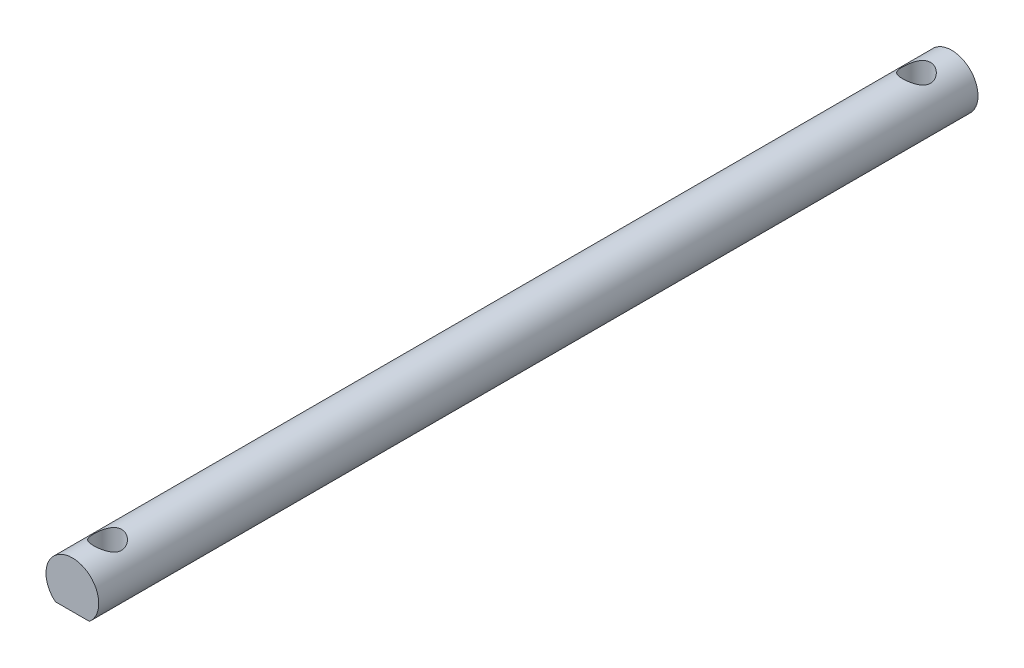
ISO-10303-21;
HEADER;
FILE_DESCRIPTION(('STEP AP214'),'2;1');
FILE_NAME('part.step','',(''),(''),'','','');
FILE_SCHEMA(('AUTOMOTIVE_DESIGN { 1 0 10303 214 1 1 1 1 }'));
ENDSEC;
DATA;
#1=APPLICATION_CONTEXT('core data for automotive mechanical design processes');
#2=APPLICATION_PROTOCOL_DEFINITION('international standard','automotive_design',2000,#1);
#3=PRODUCT_CONTEXT('',#1,'mechanical');
#4=PRODUCT('Part','Part','',(#3));
#5=PRODUCT_RELATED_PRODUCT_CATEGORY('part','',(#4));
#6=PRODUCT_DEFINITION_FORMATION('','',#4);
#7=PRODUCT_DEFINITION_CONTEXT('part definition',#1,'design');
#8=PRODUCT_DEFINITION('design','',#6,#7);
#9=PRODUCT_DEFINITION_SHAPE('','',#8);
#10=(LENGTH_UNIT() NAMED_UNIT(*) SI_UNIT(.MILLI.,.METRE.));
#11=(NAMED_UNIT(*) PLANE_ANGLE_UNIT() SI_UNIT($,.RADIAN.));
#12=(NAMED_UNIT(*) SI_UNIT($,.STERADIAN.) SOLID_ANGLE_UNIT());
#13=UNCERTAINTY_MEASURE_WITH_UNIT(LENGTH_MEASURE(1.E-05),#10,'distance_accuracy_value','');
#14=(GEOMETRIC_REPRESENTATION_CONTEXT(3) GLOBAL_UNCERTAINTY_ASSIGNED_CONTEXT((#13)) GLOBAL_UNIT_ASSIGNED_CONTEXT((#10,
#11,#12)) REPRESENTATION_CONTEXT('',''));
#15=CARTESIAN_POINT('',(0.,0.,0.));
#16=DIRECTION('',(0.,0.,1.));
#17=DIRECTION('',(1.,0.,0.));
#18=AXIS2_PLACEMENT_3D('',#15,#16,#17);
#19=CARTESIAN_POINT('',(0.,3.14727302685781,50.));
#20=DIRECTION('',(0.,0.,-1.));
#21=DIRECTION('',(-1.,0.,0.));
#22=AXIS2_PLACEMENT_3D('',#19,#20,#21);
#23=CYLINDRICAL_SURFACE('',#22,1.5);
#24=CARTESIAN_POINT('',(0.,3.14727302685781,50.));
#25=DIRECTION('',(0.,0.,1.));
#26=DIRECTION('',(1.,0.,0.));
#27=AXIS2_PLACEMENT_3D('',#24,#25,#26);
#28=CIRCLE('',#27,1.5);
#29=CARTESIAN_POINT('',(0.96631495996105,2.,50.));
#30=VERTEX_POINT('',#29);
#31=CARTESIAN_POINT('',(-0.96631495996105,2.,50.));
#32=VERTEX_POINT('',#31);
#33=EDGE_CURVE('E115',#30,#32,#28,.T.);
#34=ORIENTED_EDGE('',*,*,#33,.F.);
#35=DIRECTION('',(0.,0.,-1.));
#36=VECTOR('',#35,1.);
#37=CARTESIAN_POINT('',(0.96631495996105,2.,50.));
#38=LINE('',#37,#36);
#39=CARTESIAN_POINT('',(0.96631495996105,2.,46.5));
#40=VERTEX_POINT('',#39);
#41=EDGE_CURVE('E57',#30,#40,#38,.T.);
#42=ORIENTED_EDGE('',*,*,#41,.T.);
#43=CARTESIAN_POINT('',(0.,3.14727302685781,46.5));
#44=DIRECTION('',(0.,0.,1.));
#45=DIRECTION('',(1.,0.,0.));
#46=AXIS2_PLACEMENT_3D('',#43,#44,#45);
#47=CIRCLE('',#46,1.5);
#48=CARTESIAN_POINT('',(-0.96631495996105,2.,46.5));
#49=VERTEX_POINT('',#48);
#50=EDGE_CURVE('E11',#49,#40,#47,.T.);
#51=ORIENTED_EDGE('',*,*,#50,.F.);
#52=DIRECTION('',(0.,0.,-1.));
#53=VECTOR('',#52,1.);
#54=CARTESIAN_POINT('',(-0.96631495996105,2.,50.));
#55=LINE('',#54,#53);
#56=EDGE_CURVE('E105',#49,#32,#55,.F.);
#57=ORIENTED_EDGE('',*,*,#56,.T.);
#58=EDGE_LOOP('',(#34,#42,#51,#57));
#59=FACE_BOUND('',#58,.T.);
#60=CARTESIAN_POINT('',(0.,3.14727302685781,3.5));
#61=DIRECTION('',(0.,0.,-1.));
#62=DIRECTION('',(-1.,0.,0.));
#63=AXIS2_PLACEMENT_3D('',#60,#61,#62);
#64=CIRCLE('',#63,1.5);
#65=CARTESIAN_POINT('',(0.966314959961051,2.,3.5));
#66=VERTEX_POINT('',#65);
#67=CARTESIAN_POINT('',(-0.96631495996105,2.,3.5));
#68=VERTEX_POINT('',#67);
#69=EDGE_CURVE('E49',#66,#68,#64,.T.);
#70=ORIENTED_EDGE('',*,*,#69,.F.);
#71=DIRECTION('',(0.,0.,-1.));
#72=VECTOR('',#71,1.);
#73=CARTESIAN_POINT('',(0.96631495996105,2.,50.));
#74=LINE('',#73,#72);
#75=CARTESIAN_POINT('',(0.96631495996105,2.,0.));
#76=VERTEX_POINT('',#75);
#77=EDGE_CURVE('E92',#66,#76,#74,.T.);
#78=ORIENTED_EDGE('',*,*,#77,.T.);
#79=CARTESIAN_POINT('',(0.,3.14727302685781,0.));
#80=DIRECTION('',(0.,0.,1.));
#81=DIRECTION('',(1.,0.,0.));
#82=AXIS2_PLACEMENT_3D('',#79,#80,#81);
#83=CIRCLE('',#82,1.5);
#84=CARTESIAN_POINT('',(-0.96631495996105,2.,0.));
#85=VERTEX_POINT('',#84);
#86=EDGE_CURVE('E100',#76,#85,#83,.T.);
#87=ORIENTED_EDGE('',*,*,#86,.T.);
#88=DIRECTION('',(0.,0.,-1.));
#89=VECTOR('',#88,1.);
#90=CARTESIAN_POINT('',(-0.96631495996105,2.,50.));
#91=LINE('',#90,#89);
#92=EDGE_CURVE('E65',#85,#68,#91,.F.);
#93=ORIENTED_EDGE('',*,*,#92,.T.);
#94=EDGE_LOOP('',(#70,#78,#87,#93));
#95=FACE_BOUND('',#94,.T.);
#96=CARTESIAN_POINT('',(0.,4.64727302685781,1.2));
#97=CARTESIAN_POINT('',(-0.041714004293709,4.64727061100229,1.20000270828978));
#98=CARTESIAN_POINT('',(-0.0834672912539169,4.64551492046005,1.20328159641244));
#99=CARTESIAN_POINT('',(-0.165718197334509,4.63866432353752,1.21624170086605));
#100=CARTESIAN_POINT('',(-0.206213769841148,4.63356424555145,1.22593283300351));
#101=CARTESIAN_POINT('',(-0.284638594945811,4.62055339486435,1.25121983985831));
#102=CARTESIAN_POINT('',(-0.322577512237572,4.61265400677281,1.26679181418989));
#103=CARTESIAN_POINT('',(-0.395235474229212,4.59475052558151,1.30326255171199));
#104=CARTESIAN_POINT('',(-0.429954504316263,4.58474642293057,1.3241613390756));
#105=CARTESIAN_POINT('',(-0.497767319459639,4.56275203351812,1.37225156173175));
#106=CARTESIAN_POINT('',(-0.530602027463185,4.55067417496511,1.39976760351975));
#107=CARTESIAN_POINT('',(-0.591434030661653,4.52614344853048,1.45960314568675));
#108=CARTESIAN_POINT('',(-0.619427089896366,4.51369026334744,1.49192680673365));
#109=CARTESIAN_POINT('',(-0.672354419511099,4.48849443368043,1.56397805847776));
#110=CARTESIAN_POINT('',(-0.696776837026744,4.47582898387146,1.60411204866305));
#111=CARTESIAN_POINT('',(-0.738426416316995,4.45314141355328,1.68864568135116));
#112=CARTESIAN_POINT('',(-0.755659138193531,4.44311725264017,1.73304199480675));
#113=CARTESIAN_POINT('',(-0.781243551670882,4.42784697534304,1.82205426936129));
#114=CARTESIAN_POINT('',(-0.790083117424791,4.42234132251058,1.86648297209041));
#115=CARTESIAN_POINT('',(-0.800094972405448,4.41608633842723,1.95650387196576));
#116=CARTESIAN_POINT('',(-0.801276946959554,4.41533099901163,2.00209452613423));
#117=CARTESIAN_POINT('',(-0.796296021649253,4.41845951490916,2.08622186564664));
#118=CARTESIAN_POINT('',(-0.791143222976705,4.42170554042171,2.12484844662223));
#119=CARTESIAN_POINT('',(-0.775413455073683,4.43133619967712,2.20057462394201));
#120=CARTESIAN_POINT('',(-0.764834303757537,4.4377220960056,2.23767359950573));
#121=CARTESIAN_POINT('',(-0.738390252390663,4.4530358054286,2.31033802657356));
#122=CARTESIAN_POINT('',(-0.722411944930874,4.46201750086228,2.34585030308501));
#123=CARTESIAN_POINT('',(-0.685716522966988,4.4815234976867,2.4138695263574));
#124=CARTESIAN_POINT('',(-0.664997308543691,4.49204848191166,2.44637513236902));
#125=CARTESIAN_POINT('',(-0.615868522436844,4.51531827626026,2.51248586121327));
#126=CARTESIAN_POINT('',(-0.586776291159891,4.52816202179022,2.54555073524671));
#127=CARTESIAN_POINT('',(-0.523451373374352,4.55338861308904,2.60657535768995));
#128=CARTESIAN_POINT('',(-0.489215573049463,4.56577117396009,2.63453199079312));
#129=CARTESIAN_POINT('',(-0.414022077031181,4.58957313685314,2.68613771491421));
#130=CARTESIAN_POINT('',(-0.372785484410792,4.60089125773953,2.70943110819391));
#131=CARTESIAN_POINT('',(-0.286226859736145,4.62037697990036,2.7485478831769));
#132=CARTESIAN_POINT('',(-0.240908517249558,4.62854739187482,2.76437793200312));
#133=CARTESIAN_POINT('',(-0.151832213955905,4.64018298300011,2.78667761240728));
#134=CARTESIAN_POINT('',(-0.108300131382031,4.64400507678257,2.79386070130999));
#135=CARTESIAN_POINT('',(-0.0204895975412033,4.64777523712983,2.80094750320043));
#136=CARTESIAN_POINT('',(0.0237884072844007,4.64772554401872,2.80085542580229));
#137=CARTESIAN_POINT('',(0.107545959760608,4.64394684944613,2.79375007116933));
#138=CARTESIAN_POINT('',(0.147096449267732,4.64055199930067,2.78736535925174));
#139=CARTESIAN_POINT('',(0.224469554831582,4.63089491013627,2.76889255790208));
#140=CARTESIAN_POINT('',(0.262291990687247,4.62463237282267,2.7568038751433));
#141=CARTESIAN_POINT('',(0.336250167522202,4.6095987349747,2.72702505753177));
#142=CARTESIAN_POINT('',(0.372320333376869,4.60076897648171,2.70920276508172));
#143=CARTESIAN_POINT('',(0.441062157410962,4.58140740767542,2.6686248456984));
#144=CARTESIAN_POINT('',(0.473732482002725,4.57087493357745,2.6458672936231));
#145=CARTESIAN_POINT('',(0.538489644606411,4.54774948381134,2.59325519889227));
#146=CARTESIAN_POINT('',(0.570134865108252,4.5350567565271,2.56290033267114));
#147=CARTESIAN_POINT('',(0.628109862741503,4.50980011235093,2.49738716408484));
#148=CARTESIAN_POINT('',(0.654434715474712,4.49723632491743,2.46222446170796));
#149=CARTESIAN_POINT('',(0.70274076630891,4.47276817013746,2.38517351382497));
#150=CARTESIAN_POINT('',(0.724310244689175,4.46096513414908,2.34299186122059));
#151=CARTESIAN_POINT('',(0.759824848176573,4.44075237748749,2.25478990991383));
#152=CARTESIAN_POINT('',(0.773780830369481,4.43233782923438,2.20877518587825));
#153=CARTESIAN_POINT('',(0.792295451806952,4.42099816146799,2.11898615290246));
#154=CARTESIAN_POINT('',(0.797640611545244,4.41761611368446,2.07543381628454));
#155=CARTESIAN_POINT('',(0.801103834511684,4.41543662573423,1.98793968581964));
#156=CARTESIAN_POINT('',(0.799226824740039,4.41663606005343,1.94399817787743));
#157=CARTESIAN_POINT('',(0.789056350744178,4.42297550363614,1.86265364514195));
#158=CARTESIAN_POINT('',(0.781570591370404,4.42761878238289,1.82510510927249));
#159=CARTESIAN_POINT('',(0.761493436479322,4.43965994406853,1.75186604245893));
#160=CARTESIAN_POINT('',(0.748900147495982,4.44705884849119,1.71617620611579));
#161=CARTESIAN_POINT('',(0.718080352112418,4.4643496826021,1.64509522045344));
#162=CARTESIAN_POINT('',(0.699543207429632,4.4743715109762,1.60987143258423));
#163=CARTESIAN_POINT('',(0.657671226676286,4.49561263392224,1.54279806424025));
#164=CARTESIAN_POINT('',(0.634333807313365,4.50683257169302,1.51095031464064));
#165=CARTESIAN_POINT('',(0.579583602633468,4.53114572492608,1.44672690611971));
#166=CARTESIAN_POINT('',(0.547491018352179,4.54427514760882,1.41494125955117));
#167=CARTESIAN_POINT('',(0.47815016455982,4.56950132744853,1.35702772961191));
#168=CARTESIAN_POINT('',(0.440898582826824,4.581597413042,1.3309035088962));
#169=CARTESIAN_POINT('',(0.361022002622199,4.60378317795302,1.28456604006334));
#170=CARTESIAN_POINT('',(0.318288665753909,4.6138171327834,1.26451137357511));
#171=CARTESIAN_POINT('',(0.229399331630397,4.63031159256955,1.23214637726613));
#172=CARTESIAN_POINT('',(0.183252846928633,4.63678163400516,1.21981536787766));
#173=CARTESIAN_POINT('',(0.113807677907482,4.64312078794928,1.20780732872793));
#174=CARTESIAN_POINT('',(0.0911777471195388,4.64467247001677,1.20488511579837));
#175=CARTESIAN_POINT('',(0.0457024774465213,4.646749257487,1.20098069784147));
#176=CARTESIAN_POINT('',(0.0228571359907306,4.64727435062278,1.19999851599603));
#177=CARTESIAN_POINT('',(0.,4.64727302685781,1.2));
#178=B_SPLINE_CURVE_WITH_KNOTS('',3,(#96,#97,#98,#99,#100,#101,#102,#103,#104,#105,#106,#107,
#108,#109,#110,#111,#112,#113,#114,#115,#116,#117,#118,#119,#120,#121,#122,#123,#124,#125,#126,
#127,#128,#129,#130,#131,#132,#133,#134,#135,#136,#137,#138,#139,#140,#141,#142,#143,#144,#145,
#146,#147,#148,#149,#150,#151,#152,#153,#154,#155,#156,#157,#158,#159,#160,#161,#162,#163,#164,
#165,#166,#167,#168,#169,#170,#171,#172,#173,#174,#175,#176,#177),.UNSPECIFIED.,.T.,.F.,(4,2,2,
2,2,2,2,2,2,2,2,2,2,2,2,2,2,2,2,2,2,2,2,2,2,2,2,2,2,2,2,2,2,2,2,2,2,2,2,2,4),(0.,
0.125049785968992,0.250293400579707,0.375033395431379,0.49977395636337,0.632758937517726,
0.765859685119311,0.911100210896853,1.0562282067719,1.19228300426694,1.32816568589671,
1.44492819552126,1.5617376954166,1.68117137196064,1.80065805275817,1.93770170276478,
2.07482865313357,2.22012229846781,2.3652859036198,2.49740165319181,2.62944095746675,
2.74950324975936,2.86957803367867,2.99264692026345,3.11576390008819,3.2521377258514,
3.38863720347795,3.53432584534744,3.67980618389779,3.81103787448892,3.94218005404205,
4.05738088818269,4.17262446873054,4.29529226385602,4.41802624681407,4.55851375899382,
4.69909188991155,4.84307664846753,4.98667423094967,5.05519428454422,5.12371515689634),.UNSPECIFIED.);
#179=CARTESIAN_POINT('',(0.,4.64727302685781,1.2));
#180=VERTEX_POINT('',#179);
#181=EDGE_CURVE('E95',#180,#180,#178,.T.);
#182=ORIENTED_EDGE('',*,*,#181,.F.);
#183=EDGE_LOOP('',(#182));
#184=FACE_BOUND('',#183,.T.);
#185=CARTESIAN_POINT('',(0.,4.64727302685781,47.2));
#186=CARTESIAN_POINT('',(-0.0417140042937093,4.64727061100229,47.2000027082898));
#187=CARTESIAN_POINT('',(-0.0834672912539174,4.64551492046005,47.2032815964124));
#188=CARTESIAN_POINT('',(-0.16571819733451,4.63866432353752,47.216241700866));
#189=CARTESIAN_POINT('',(-0.206213769841149,4.63356424555145,47.2259328330035));
#190=CARTESIAN_POINT('',(-0.284638594945813,4.62055339486434,47.2512198398583));
#191=CARTESIAN_POINT('',(-0.322577512237574,4.61265400677281,47.2667918141899));
#192=CARTESIAN_POINT('',(-0.395235474229214,4.5947505255815,47.303262551712));
#193=CARTESIAN_POINT('',(-0.429954504316266,4.58474642293057,47.3241613390756));
#194=CARTESIAN_POINT('',(-0.497767319459641,4.56275203351812,47.3722515617318));
#195=CARTESIAN_POINT('',(-0.530602027463187,4.55067417496511,47.3997676035197));
#196=CARTESIAN_POINT('',(-0.591434030661654,4.52614344853048,47.4596031456867));
#197=CARTESIAN_POINT('',(-0.619427089896367,4.51369026334744,47.4919268067337));
#198=CARTESIAN_POINT('',(-0.672354419511101,4.48849443368043,47.5639780584778));
#199=CARTESIAN_POINT('',(-0.696776837026746,4.47582898387146,47.604112048663));
#200=CARTESIAN_POINT('',(-0.738426416316998,4.45314141355328,47.6886456813512));
#201=CARTESIAN_POINT('',(-0.755659138193533,4.44311725264017,47.7330419948067));
#202=CARTESIAN_POINT('',(-0.781243551670884,4.42784697534304,47.8220542693613));
#203=CARTESIAN_POINT('',(-0.790083117424793,4.42234132251058,47.8664829720904));
#204=CARTESIAN_POINT('',(-0.80009497240545,4.41608633842723,47.9565038719658));
#205=CARTESIAN_POINT('',(-0.801276946959556,4.41533099901163,48.0020945261342));
#206=CARTESIAN_POINT('',(-0.796296021649255,4.41845951490916,48.0862218656466));
#207=CARTESIAN_POINT('',(-0.791143222976708,4.42170554042171,48.1248484466222));
#208=CARTESIAN_POINT('',(-0.775413455073686,4.43133619967712,48.200574623942));
#209=CARTESIAN_POINT('',(-0.76483430375754,4.4377220960056,48.2376735995057));
#210=CARTESIAN_POINT('',(-0.738390252390665,4.45303580542859,48.3103380265736));
#211=CARTESIAN_POINT('',(-0.722411944930876,4.46201750086227,48.345850303085));
#212=CARTESIAN_POINT('',(-0.68571652296699,4.4815234976867,48.4138695263574));
#213=CARTESIAN_POINT('',(-0.664997308543694,4.49204848191166,48.446375132369));
#214=CARTESIAN_POINT('',(-0.615868522436846,4.51531827626026,48.5124858612133));
#215=CARTESIAN_POINT('',(-0.586776291159892,4.52816202179022,48.5455507352467));
#216=CARTESIAN_POINT('',(-0.523451373374352,4.55338861308904,48.60657535769));
#217=CARTESIAN_POINT('',(-0.489215573049463,4.56577117396009,48.6345319907931));
#218=CARTESIAN_POINT('',(-0.414022077031182,4.58957313685314,48.6861377149142));
#219=CARTESIAN_POINT('',(-0.372785484410792,4.60089125773953,48.7094311081939));
#220=CARTESIAN_POINT('',(-0.286226859736145,4.62037697990036,48.7485478831769));
#221=CARTESIAN_POINT('',(-0.240908517249558,4.62854739187482,48.7643779320031));
#222=CARTESIAN_POINT('',(-0.151832213955905,4.64018298300011,48.7866776124073));
#223=CARTESIAN_POINT('',(-0.108300131382032,4.64400507678257,48.79386070131));
#224=CARTESIAN_POINT('',(-0.0204895975412045,4.64777523712983,48.8009475032004));
#225=CARTESIAN_POINT('',(0.0237884072843992,4.64772554401871,48.8008554258023));
#226=CARTESIAN_POINT('',(0.107545959760607,4.64394684944613,48.7937500711693));
#227=CARTESIAN_POINT('',(0.147096449267732,4.64055199930067,48.7873653592517));
#228=CARTESIAN_POINT('',(0.224469554831583,4.63089491013627,48.7688925579021));
#229=CARTESIAN_POINT('',(0.262291990687247,4.62463237282267,48.7568038751433));
#230=CARTESIAN_POINT('',(0.336250167522203,4.6095987349747,48.7270250575318));
#231=CARTESIAN_POINT('',(0.372320333376872,4.60076897648171,48.7092027650817));
#232=CARTESIAN_POINT('',(0.441062157410964,4.58140740767542,48.6686248456984));
#233=CARTESIAN_POINT('',(0.473732482002726,4.57087493357745,48.6458672936231));
#234=CARTESIAN_POINT('',(0.538489644606411,4.54774948381134,48.5932551988923));
#235=CARTESIAN_POINT('',(0.570134865108252,4.5350567565271,48.5629003326711));
#236=CARTESIAN_POINT('',(0.628109862741503,4.50980011235093,48.4973871640848));
#237=CARTESIAN_POINT('',(0.654434715474713,4.49723632491743,48.462224461708));
#238=CARTESIAN_POINT('',(0.702740766308913,4.47276817013746,48.385173513825));
#239=CARTESIAN_POINT('',(0.724310244689179,4.46096513414907,48.3429918612206));
#240=CARTESIAN_POINT('',(0.759824848176576,4.44075237748748,48.2547899099138));
#241=CARTESIAN_POINT('',(0.773780830369484,4.43233782923438,48.2087751858783));
#242=CARTESIAN_POINT('',(0.792295451806955,4.42099816146799,48.1189861529025));
#243=CARTESIAN_POINT('',(0.797640611545247,4.41761611368446,48.0754338162845));
#244=CARTESIAN_POINT('',(0.801103834511686,4.41543662573422,47.9879396858196));
#245=CARTESIAN_POINT('',(0.799226824740041,4.41663606005343,47.9439981778774));
#246=CARTESIAN_POINT('',(0.789056350744181,4.42297550363614,47.862653645142));
#247=CARTESIAN_POINT('',(0.781570591370408,4.42761878238289,47.8251051092725));
#248=CARTESIAN_POINT('',(0.761493436479327,4.43965994406853,47.7518660424589));
#249=CARTESIAN_POINT('',(0.748900147495987,4.44705884849119,47.7161762061158));
#250=CARTESIAN_POINT('',(0.718080352112423,4.4643496826021,47.6450952204534));
#251=CARTESIAN_POINT('',(0.699543207429637,4.4743715109762,47.6098714325842));
#252=CARTESIAN_POINT('',(0.65767122667629,4.49561263392224,47.5427980642403));
#253=CARTESIAN_POINT('',(0.634333807313369,4.50683257169302,47.5109503146406));
#254=CARTESIAN_POINT('',(0.579583602633472,4.53114572492608,47.4467269061197));
#255=CARTESIAN_POINT('',(0.547491018352183,4.54427514760882,47.4149412595512));
#256=CARTESIAN_POINT('',(0.478150164559824,4.56950132744853,47.3570277296119));
#257=CARTESIAN_POINT('',(0.44089858282683,4.581597413042,47.3309035088962));
#258=CARTESIAN_POINT('',(0.361022002622206,4.60378317795302,47.2845660400633));
#259=CARTESIAN_POINT('',(0.318288665753917,4.6138171327834,47.2645113735751));
#260=CARTESIAN_POINT('',(0.229399331630405,4.63031159256955,47.2321463772661));
#261=CARTESIAN_POINT('',(0.18325284692864,4.63678163400516,47.2198153678777));
#262=CARTESIAN_POINT('',(0.113807677907487,4.64312078794927,47.2078073287279));
#263=CARTESIAN_POINT('',(0.0911777471195426,4.64467247001677,47.2048851157984));
#264=CARTESIAN_POINT('',(0.0457024774465231,4.646749257487,47.2009806978415));
#265=CARTESIAN_POINT('',(0.0228571359907315,4.64727435062278,47.199998515996));
#266=CARTESIAN_POINT('',(0.,4.64727302685781,47.2));
#267=B_SPLINE_CURVE_WITH_KNOTS('',3,(#185,#186,#187,#188,#189,#190,#191,#192,#193,#194,#195,
#196,#197,#198,#199,#200,#201,#202,#203,#204,#205,#206,#207,#208,#209,#210,#211,#212,#213,#214,
#215,#216,#217,#218,#219,#220,#221,#222,#223,#224,#225,#226,#227,#228,#229,#230,#231,#232,#233,
#234,#235,#236,#237,#238,#239,#240,#241,#242,#243,#244,#245,#246,#247,#248,#249,#250,#251,#252,
#253,#254,#255,#256,#257,#258,#259,#260,#261,#262,#263,#264,#265,#266),.UNSPECIFIED.,.T.,.F.,(4,
2,2,2,2,2,2,2,2,2,2,2,2,2,2,2,2,2,2,2,2,2,2,2,2,2,2,2,2,2,2,2,2,2,2,2,2,2,2,2,4),(0.,
0.125049785968993,0.250293400579708,0.375033395431381,0.499773956363373,0.632758937517726,
0.765859685119313,0.911100210896861,1.0562282067719,1.19228300426694,1.32816568589671,
1.44492819552126,1.5617376954166,1.68117137196064,1.80065805275817,1.93770170276479,
2.07482865313358,2.22012229846782,2.3652859036198,2.49740165319182,2.62944095746675,
2.74950324975936,2.86957803367868,2.99264692026346,3.1157639000882,3.25213772585141,
3.38863720347796,3.53432584534746,3.6798061838978,3.81103787448894,3.94218005404206,
4.0573808881827,4.17262446873054,4.29529226385603,4.41802624681409,4.55851375899383,
4.69909188991156,4.84307664846754,4.98667423094968,5.05519428454423,5.12371515689635),.UNSPECIFIED.);
#268=CARTESIAN_POINT('',(0.,4.64727302685781,47.2));
#269=VERTEX_POINT('',#268);
#270=EDGE_CURVE('E128',#269,#269,#267,.T.);
#271=ORIENTED_EDGE('',*,*,#270,.F.);
#272=EDGE_LOOP('',(#271));
#273=FACE_BOUND('',#272,.T.);
#274=ADVANCED_FACE('F39',(#59,#95,#184,#273),#23,.T.);
#275=CARTESIAN_POINT('',(0.,3.14727302685781,50.));
#276=DIRECTION('',(0.,0.,1.));
#277=DIRECTION('',(1.,0.,0.));
#278=AXIS2_PLACEMENT_3D('',#275,#276,#277);
#279=PLANE('',#278);
#280=DIRECTION('',(-1.,0.,0.));
#281=VECTOR('',#280,1.);
#282=CARTESIAN_POINT('',(0.,2.,50.));
#283=LINE('',#282,#281);
#284=EDGE_CURVE('E89',#30,#32,#283,.T.);
#285=ORIENTED_EDGE('',*,*,#284,.F.);
#286=ORIENTED_EDGE('',*,*,#33,.T.);
#287=EDGE_LOOP('',(#285,#286));
#288=FACE_BOUND('',#287,.T.);
#289=ADVANCED_FACE('F169',(#288),#279,.T.);
#290=CARTESIAN_POINT('',(0.,3.14727302685781,0.));
#291=DIRECTION('',(0.,0.,1.));
#292=DIRECTION('',(1.,0.,0.));
#293=AXIS2_PLACEMENT_3D('',#290,#291,#292);
#294=PLANE('',#293);
#295=ORIENTED_EDGE('',*,*,#86,.F.);
#296=DIRECTION('',(-1.,0.,0.));
#297=VECTOR('',#296,1.);
#298=CARTESIAN_POINT('',(0.,2.,0.));
#299=LINE('',#298,#297);
#300=EDGE_CURVE('E119',#76,#85,#299,.T.);
#301=ORIENTED_EDGE('',*,*,#300,.T.);
#302=EDGE_LOOP('',(#295,#301));
#303=FACE_BOUND('',#302,.T.);
#304=ADVANCED_FACE('F168',(#303),#294,.F.);
#305=CARTESIAN_POINT('',(-1.,2.,3.5));
#306=DIRECTION('',(0.,0.,-1.));
#307=DIRECTION('',(-1.,0.,0.));
#308=AXIS2_PLACEMENT_3D('',#305,#306,#307);
#309=PLANE('',#308);
#310=ORIENTED_EDGE('',*,*,#69,.T.);
#311=DIRECTION('',(1.,0.,0.));
#312=VECTOR('',#311,1.);
#313=CARTESIAN_POINT('',(-1.,2.,3.5));
#314=LINE('',#313,#312);
#315=EDGE_CURVE('E85',#68,#66,#314,.T.);
#316=ORIENTED_EDGE('',*,*,#315,.T.);
#317=EDGE_LOOP('',(#310,#316));
#318=FACE_BOUND('',#317,.T.);
#319=ADVANCED_FACE('F84',(#318),#309,.T.);
#320=CARTESIAN_POINT('',(0.,2.,0.));
#321=DIRECTION('',(0.,1.,0.));
#322=DIRECTION('',(0.,0.,1.));
#323=AXIS2_PLACEMENT_3D('',#320,#321,#322);
#324=PLANE('',#323);
#325=CARTESIAN_POINT('',(0.,2.,2.));
#326=DIRECTION('',(0.,1.,0.));
#327=DIRECTION('',(0.,0.,1.));
#328=AXIS2_PLACEMENT_3D('',#325,#326,#327);
#329=CIRCLE('',#328,0.8);
#330=CARTESIAN_POINT('',(0.,2.,2.8));
#331=VERTEX_POINT('',#330);
#332=EDGE_CURVE('E43',#331,#331,#329,.F.);
#333=ORIENTED_EDGE('',*,*,#332,.F.);
#334=EDGE_LOOP('',(#333));
#335=FACE_BOUND('',#334,.T.);
#336=ORIENTED_EDGE('',*,*,#315,.F.);
#337=ORIENTED_EDGE('',*,*,#92,.F.);
#338=ORIENTED_EDGE('',*,*,#300,.F.);
#339=ORIENTED_EDGE('',*,*,#77,.F.);
#340=EDGE_LOOP('',(#336,#337,#338,#339));
#341=FACE_BOUND('',#340,.T.);
#342=ADVANCED_FACE('F91',(#335,#341),#324,.F.);
#343=CARTESIAN_POINT('',(-1.,2.,46.5));
#344=DIRECTION('',(0.,0.,1.));
#345=DIRECTION('',(1.,0.,0.));
#346=AXIS2_PLACEMENT_3D('',#343,#344,#345);
#347=PLANE('',#346);
#348=ORIENTED_EDGE('',*,*,#50,.T.);
#349=DIRECTION('',(-1.,0.,0.));
#350=VECTOR('',#349,1.);
#351=CARTESIAN_POINT('',(-1.,2.,46.5));
#352=LINE('',#351,#350);
#353=EDGE_CURVE('E94',#40,#49,#352,.T.);
#354=ORIENTED_EDGE('',*,*,#353,.T.);
#355=EDGE_LOOP('',(#348,#354));
#356=FACE_BOUND('',#355,.T.);
#357=ADVANCED_FACE('F158',(#356),#347,.T.);
#358=CARTESIAN_POINT('',(0.,2.,0.));
#359=DIRECTION('',(0.,1.,0.));
#360=DIRECTION('',(0.,0.,1.));
#361=AXIS2_PLACEMENT_3D('',#358,#359,#360);
#362=PLANE('',#361);
#363=CARTESIAN_POINT('',(0.,2.,48.));
#364=DIRECTION('',(0.,1.,0.));
#365=DIRECTION('',(0.,0.,1.));
#366=AXIS2_PLACEMENT_3D('',#363,#364,#365);
#367=CIRCLE('',#366,0.800000000000002);
#368=CARTESIAN_POINT('',(0.,2.,48.8));
#369=VERTEX_POINT('',#368);
#370=EDGE_CURVE('E125',#369,#369,#367,.F.);
#371=ORIENTED_EDGE('',*,*,#370,.F.);
#372=EDGE_LOOP('',(#371));
#373=FACE_BOUND('',#372,.T.);
#374=ORIENTED_EDGE('',*,*,#284,.T.);
#375=ORIENTED_EDGE('',*,*,#56,.F.);
#376=ORIENTED_EDGE('',*,*,#353,.F.);
#377=ORIENTED_EDGE('',*,*,#41,.F.);
#378=EDGE_LOOP('',(#374,#375,#376,#377));
#379=FACE_BOUND('',#378,.T.);
#380=ADVANCED_FACE('F151',(#373,#379),#362,.F.);
#381=CARTESIAN_POINT('',(0.,50.,48.));
#382=DIRECTION('',(0.,-1.,0.));
#383=DIRECTION('',(0.,0.,-1.));
#384=AXIS2_PLACEMENT_3D('',#381,#382,#383);
#385=CYLINDRICAL_SURFACE('',#384,0.800000000000002);
#386=ORIENTED_EDGE('',*,*,#370,.T.);
#387=EDGE_LOOP('',(#386));
#388=FACE_BOUND('',#387,.T.);
#389=ORIENTED_EDGE('',*,*,#270,.T.);
#390=EDGE_LOOP('',(#389));
#391=FACE_BOUND('',#390,.T.);
#392=ADVANCED_FACE('F147',(#388,#391),#385,.F.);
#393=CARTESIAN_POINT('',(0.,50.,2.));
#394=DIRECTION('',(0.,-1.,0.));
#395=DIRECTION('',(0.,0.,-1.));
#396=AXIS2_PLACEMENT_3D('',#393,#394,#395);
#397=CYLINDRICAL_SURFACE('',#396,0.8);
#398=ORIENTED_EDGE('',*,*,#332,.T.);
#399=EDGE_LOOP('',(#398));
#400=FACE_BOUND('',#399,.T.);
#401=ORIENTED_EDGE('',*,*,#181,.T.);
#402=EDGE_LOOP('',(#401));
#403=FACE_BOUND('',#402,.T.);
#404=ADVANCED_FACE('F150',(#400,#403),#397,.F.);
#405=CLOSED_SHELL('',(#274,#289,#304,#319,#342,#357,#380,#392,#404));
#406=MANIFOLD_SOLID_BREP('B2',#405);
#407=ADVANCED_BREP_SHAPE_REPRESENTATION('',(#18,#406),#14);
#408=SHAPE_DEFINITION_REPRESENTATION(#9,#407);
ENDSEC;
END-ISO-10303-21;
